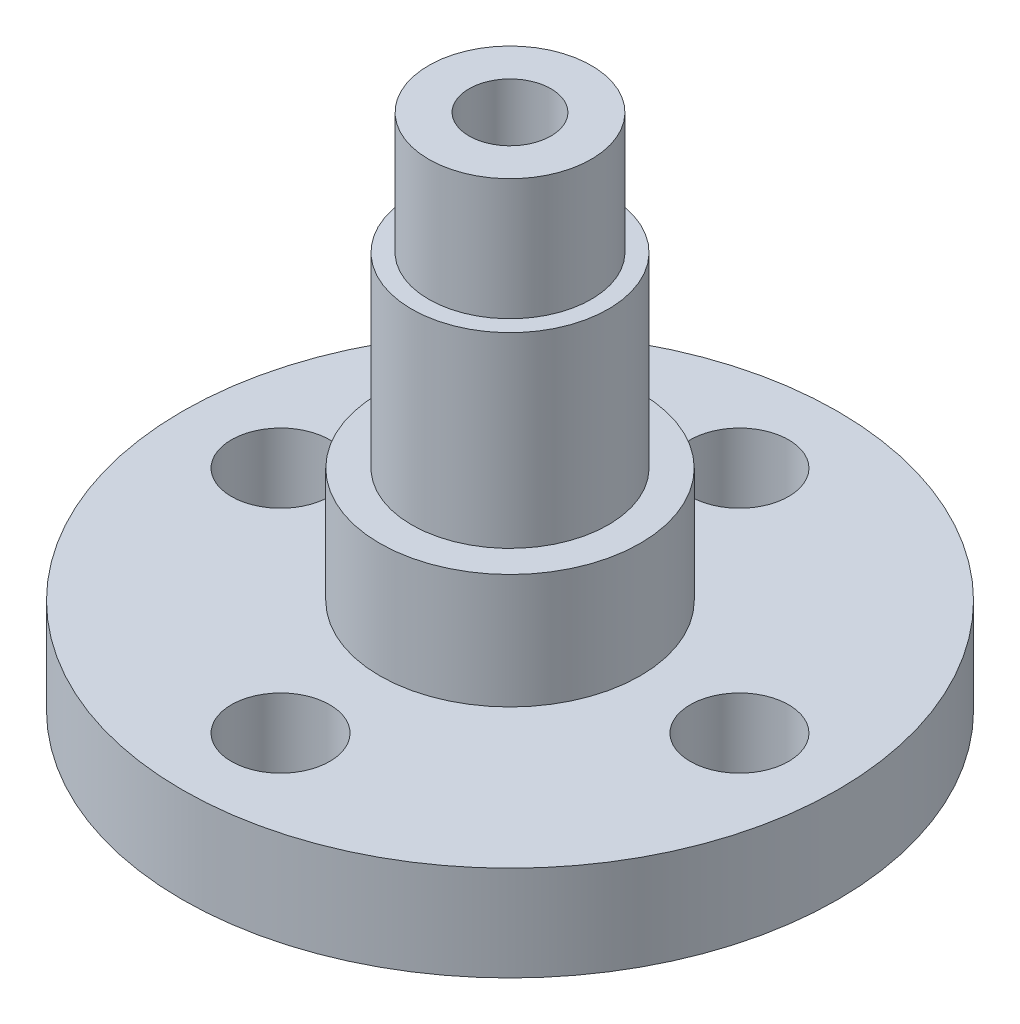
ISO-10303-21;
HEADER;
FILE_DESCRIPTION(('STEP AP214'),'2;1');
FILE_NAME('part.step','',(''),(''),'','','');
FILE_SCHEMA(('AUTOMOTIVE_DESIGN { 1 0 10303 214 1 1 1 1 }'));
ENDSEC;
DATA;
#1=APPLICATION_CONTEXT('core data for automotive mechanical design processes');
#2=APPLICATION_PROTOCOL_DEFINITION('international standard','automotive_design',2000,#1);
#3=PRODUCT_CONTEXT('',#1,'mechanical');
#4=PRODUCT('Part','Part','',(#3));
#5=PRODUCT_RELATED_PRODUCT_CATEGORY('part','',(#4));
#6=PRODUCT_DEFINITION_FORMATION('','',#4);
#7=PRODUCT_DEFINITION_CONTEXT('part definition',#1,'design');
#8=PRODUCT_DEFINITION('design','',#6,#7);
#9=PRODUCT_DEFINITION_SHAPE('','',#8);
#10=(LENGTH_UNIT() NAMED_UNIT(*) SI_UNIT(.MILLI.,.METRE.));
#11=(NAMED_UNIT(*) PLANE_ANGLE_UNIT() SI_UNIT($,.RADIAN.));
#12=(NAMED_UNIT(*) SI_UNIT($,.STERADIAN.) SOLID_ANGLE_UNIT());
#13=UNCERTAINTY_MEASURE_WITH_UNIT(LENGTH_MEASURE(1.E-05),#10,'distance_accuracy_value','');
#14=(GEOMETRIC_REPRESENTATION_CONTEXT(3) GLOBAL_UNCERTAINTY_ASSIGNED_CONTEXT((#13)) GLOBAL_UNIT_ASSIGNED_CONTEXT((#10,
#11,#12)) REPRESENTATION_CONTEXT('',''));
#15=CARTESIAN_POINT('',(0.,0.,0.));
#16=DIRECTION('',(0.,0.,1.));
#17=DIRECTION('',(1.,0.,0.));
#18=AXIS2_PLACEMENT_3D('',#15,#16,#17);
#19=CARTESIAN_POINT('',(-1.78635150621402,15.2779608029742,0.));
#20=DIRECTION('',(0.,1.,0.));
#21=DIRECTION('',(1.,0.,0.));
#22=AXIS2_PLACEMENT_3D('',#19,#20,#21);
#23=PLANE('',#22);
#24=CARTESIAN_POINT('',(-1.78635150621402,15.2779608029742,0.));
#25=DIRECTION('',(0.,-1.,0.));
#26=DIRECTION('',(0.,0.,1.));
#27=AXIS2_PLACEMENT_3D('',#24,#25,#26);
#28=CIRCLE('',#27,3.975);
#29=CARTESIAN_POINT('',(-1.78635150621402,15.2779608029742,3.975));
#30=VERTEX_POINT('',#29);
#31=EDGE_CURVE('E56',#30,#30,#28,.T.);
#32=ORIENTED_EDGE('',*,*,#31,.T.);
#33=EDGE_LOOP('',(#32));
#34=FACE_BOUND('',#33,.T.);
#35=CARTESIAN_POINT('',(5.21364849377225,15.2779608029742,0.));
#36=DIRECTION('',(0.,-1.,0.));
#37=DIRECTION('',(0.,0.,1.));
#38=AXIS2_PLACEMENT_3D('',#35,#36,#37);
#39=CIRCLE('',#38,1.5);
#40=CARTESIAN_POINT('',(5.21364849377225,15.2779608029742,1.50000000000005));
#41=VERTEX_POINT('',#40);
#42=EDGE_CURVE('E60',#41,#41,#39,.T.);
#43=ORIENTED_EDGE('',*,*,#42,.T.);
#44=EDGE_LOOP('',(#43));
#45=FACE_BOUND('',#44,.T.);
#46=CARTESIAN_POINT('',(-1.786351506214,15.2779608029742,-6.99999999998627));
#47=DIRECTION('',(0.,-1.,0.));
#48=DIRECTION('',(0.,0.,1.));
#49=AXIS2_PLACEMENT_3D('',#46,#47,#48);
#50=CIRCLE('',#49,1.5);
#51=CARTESIAN_POINT('',(-1.786351506214,15.2779608029742,-5.49999999998627));
#52=VERTEX_POINT('',#51);
#53=EDGE_CURVE('E68',#52,#52,#50,.T.);
#54=ORIENTED_EDGE('',*,*,#53,.T.);
#55=EDGE_LOOP('',(#54));
#56=FACE_BOUND('',#55,.T.);
#57=CARTESIAN_POINT('',(-8.7863515062003,15.2779608029742,0.));
#58=DIRECTION('',(0.,-1.,0.));
#59=DIRECTION('',(0.,0.,1.));
#60=AXIS2_PLACEMENT_3D('',#57,#58,#59);
#61=CIRCLE('',#60,1.5);
#62=CARTESIAN_POINT('',(-8.7863515062003,15.2779608029742,1.5));
#63=VERTEX_POINT('',#62);
#64=EDGE_CURVE('E73',#63,#63,#61,.T.);
#65=ORIENTED_EDGE('',*,*,#64,.T.);
#66=EDGE_LOOP('',(#65));
#67=FACE_BOUND('',#66,.T.);
#68=CARTESIAN_POINT('',(-1.786351506214,15.2779608029742,6.99999999998627));
#69=DIRECTION('',(0.,-1.,0.));
#70=DIRECTION('',(0.,0.,1.));
#71=AXIS2_PLACEMENT_3D('',#68,#69,#70);
#72=CIRCLE('',#71,1.5);
#73=CARTESIAN_POINT('',(-1.786351506214,15.2779608029742,8.49999999998627));
#74=VERTEX_POINT('',#73);
#75=EDGE_CURVE('E81',#74,#74,#72,.T.);
#76=ORIENTED_EDGE('',*,*,#75,.T.);
#77=EDGE_LOOP('',(#76));
#78=FACE_BOUND('',#77,.T.);
#79=CARTESIAN_POINT('',(-1.78635150621402,15.2779608029742,0.));
#80=DIRECTION('',(0.,1.,0.));
#81=DIRECTION('',(0.,0.,1.));
#82=AXIS2_PLACEMENT_3D('',#79,#80,#81);
#83=CIRCLE('',#82,10.0000000000246);
#84=CARTESIAN_POINT('',(-1.78635150621402,15.2779608029742,10.0000000000246));
#85=VERTEX_POINT('',#84);
#86=EDGE_CURVE('E89',#85,#85,#83,.T.);
#87=ORIENTED_EDGE('',*,*,#86,.T.);
#88=EDGE_LOOP('',(#87));
#89=FACE_BOUND('',#88,.T.);
#90=ADVANCED_FACE('F15',(#34,#45,#56,#67,#78,#89),#23,.T.);
#91=CARTESIAN_POINT('',(-1.78635150621402,12.3779608029706,0.));
#92=DIRECTION('',(0.,1.,0.));
#93=DIRECTION('',(1.,0.,0.));
#94=AXIS2_PLACEMENT_3D('',#91,#92,#93);
#95=PLANE('',#94);
#96=CARTESIAN_POINT('',(5.21364849377225,12.3779608029706,0.));
#97=DIRECTION('',(0.,-1.,0.));
#98=DIRECTION('',(0.,0.,1.));
#99=AXIS2_PLACEMENT_3D('',#96,#97,#98);
#100=CIRCLE('',#99,1.5);
#101=CARTESIAN_POINT('',(5.21364849377225,12.3779608029706,1.50000000000005));
#102=VERTEX_POINT('',#101);
#103=EDGE_CURVE('E64',#102,#102,#100,.T.);
#104=ORIENTED_EDGE('',*,*,#103,.F.);
#105=EDGE_LOOP('',(#104));
#106=FACE_BOUND('',#105,.T.);
#107=CARTESIAN_POINT('',(-8.7863515062003,12.3779608029706,0.));
#108=DIRECTION('',(0.,-1.,0.));
#109=DIRECTION('',(0.,0.,1.));
#110=AXIS2_PLACEMENT_3D('',#107,#108,#109);
#111=CIRCLE('',#110,1.5);
#112=CARTESIAN_POINT('',(-8.7863515062003,12.3779608029706,1.5));
#113=VERTEX_POINT('',#112);
#114=EDGE_CURVE('E77',#113,#113,#111,.T.);
#115=ORIENTED_EDGE('',*,*,#114,.F.);
#116=EDGE_LOOP('',(#115));
#117=FACE_BOUND('',#116,.T.);
#118=CARTESIAN_POINT('',(-1.786351506214,12.3779608029706,6.99999999998627));
#119=DIRECTION('',(0.,-1.,0.));
#120=DIRECTION('',(0.,0.,1.));
#121=AXIS2_PLACEMENT_3D('',#118,#119,#120);
#122=CIRCLE('',#121,1.5);
#123=CARTESIAN_POINT('',(-1.786351506214,12.3779608029706,8.49999999998627));
#124=VERTEX_POINT('',#123);
#125=EDGE_CURVE('E85',#124,#124,#122,.T.);
#126=ORIENTED_EDGE('',*,*,#125,.F.);
#127=EDGE_LOOP('',(#126));
#128=FACE_BOUND('',#127,.T.);
#129=CARTESIAN_POINT('',(-1.786351506214,12.3779608029706,-6.99999999998627));
#130=DIRECTION('',(0.,-1.,0.));
#131=DIRECTION('',(0.,0.,1.));
#132=AXIS2_PLACEMENT_3D('',#129,#130,#131);
#133=CIRCLE('',#132,1.5);
#134=CARTESIAN_POINT('',(-1.786351506214,12.3779608029706,-5.49999999998627));
#135=VERTEX_POINT('',#134);
#136=EDGE_CURVE('E69',#135,#135,#133,.T.);
#137=ORIENTED_EDGE('',*,*,#136,.F.);
#138=EDGE_LOOP('',(#137));
#139=FACE_BOUND('',#138,.T.);
#140=CARTESIAN_POINT('',(-1.78635150621402,12.3779608029706,0.));
#141=DIRECTION('',(0.,1.,0.));
#142=DIRECTION('',(0.,0.,1.));
#143=AXIS2_PLACEMENT_3D('',#140,#141,#142);
#144=CIRCLE('',#143,10.0000000000246);
#145=CARTESIAN_POINT('',(-1.78635150621402,12.3779608029706,10.0000000000246));
#146=VERTEX_POINT('',#145);
#147=EDGE_CURVE('E93',#146,#146,#144,.T.);
#148=ORIENTED_EDGE('',*,*,#147,.F.);
#149=EDGE_LOOP('',(#148));
#150=FACE_BOUND('',#149,.T.);
#151=ADVANCED_FACE('F105',(#106,#117,#128,#139,#150),#95,.F.);
#152=CARTESIAN_POINT('',(-1.78635150621402,22.3779608029715,0.));
#153=DIRECTION('',(0.,1.,0.));
#154=DIRECTION('',(1.,0.,0.));
#155=AXIS2_PLACEMENT_3D('',#152,#153,#154);
#156=PLANE('',#155);
#157=CARTESIAN_POINT('',(-1.78635150621402,22.3779608029715,0.));
#158=DIRECTION('',(0.,1.,0.));
#159=DIRECTION('',(0.,0.,1.));
#160=AXIS2_PLACEMENT_3D('',#157,#158,#159);
#161=CIRCLE('',#160,1.25);
#162=CARTESIAN_POINT('',(-1.78635150621402,22.3779608029715,1.25));
#163=VERTEX_POINT('',#162);
#164=EDGE_CURVE('E48',#163,#163,#161,.T.);
#165=ORIENTED_EDGE('',*,*,#164,.T.);
#166=EDGE_LOOP('',(#165));
#167=FACE_BOUND('',#166,.T.);
#168=ADVANCED_FACE('F107',(#167),#156,.T.);
#169=CARTESIAN_POINT('',(-1.78635150621402,28.1779608029715,0.));
#170=DIRECTION('',(0.,1.,0.));
#171=DIRECTION('',(1.,0.,0.));
#172=AXIS2_PLACEMENT_3D('',#169,#170,#171);
#173=PLANE('',#172);
#174=CARTESIAN_POINT('',(-1.78635150621402,28.1779608029715,0.));
#175=DIRECTION('',(0.,-1.,0.));
#176=DIRECTION('',(0.,0.,1.));
#177=AXIS2_PLACEMENT_3D('',#174,#175,#176);
#178=CIRCLE('',#177,1.25);
#179=CARTESIAN_POINT('',(-1.78635150621402,28.1779608029715,1.25));
#180=VERTEX_POINT('',#179);
#181=EDGE_CURVE('E44',#180,#180,#178,.T.);
#182=ORIENTED_EDGE('',*,*,#181,.T.);
#183=EDGE_LOOP('',(#182));
#184=FACE_BOUND('',#183,.T.);
#185=CARTESIAN_POINT('',(-1.78635150621402,28.1779608029715,0.));
#186=DIRECTION('',(0.,1.,0.));
#187=DIRECTION('',(0.,0.,1.));
#188=AXIS2_PLACEMENT_3D('',#185,#186,#187);
#189=CIRCLE('',#188,2.48);
#190=CARTESIAN_POINT('',(-1.78635150621402,28.1779608029715,2.48));
#191=VERTEX_POINT('',#190);
#192=EDGE_CURVE('E10',#191,#191,#189,.T.);
#193=ORIENTED_EDGE('',*,*,#192,.T.);
#194=EDGE_LOOP('',(#193));
#195=FACE_BOUND('',#194,.T.);
#196=ADVANCED_FACE('F114',(#184,#195),#173,.T.);
#197=CARTESIAN_POINT('',(-1.78635150621402,24.4779608029706,0.));
#198=DIRECTION('',(0.,1.,0.));
#199=DIRECTION('',(1.,0.,0.));
#200=AXIS2_PLACEMENT_3D('',#197,#198,#199);
#201=PLANE('',#200);
#202=CARTESIAN_POINT('',(-1.78635150621402,24.4779608029706,0.));
#203=DIRECTION('',(0.,-1.,0.));
#204=DIRECTION('',(0.,0.,1.));
#205=AXIS2_PLACEMENT_3D('',#202,#203,#204);
#206=CIRCLE('',#205,2.48);
#207=CARTESIAN_POINT('',(-1.78635150621402,24.4779608029706,2.48));
#208=VERTEX_POINT('',#207);
#209=EDGE_CURVE('E22',#208,#208,#206,.T.);
#210=ORIENTED_EDGE('',*,*,#209,.T.);
#211=EDGE_LOOP('',(#210));
#212=FACE_BOUND('',#211,.T.);
#213=CARTESIAN_POINT('',(-1.78635150621402,24.4779608029706,0.));
#214=DIRECTION('',(0.,1.,0.));
#215=DIRECTION('',(0.,0.,1.));
#216=AXIS2_PLACEMENT_3D('',#213,#214,#215);
#217=CIRCLE('',#216,3.00000000001);
#218=CARTESIAN_POINT('',(-1.78635150621402,24.4779608029706,3.00000000001));
#219=VERTEX_POINT('',#218);
#220=EDGE_CURVE('E31',#219,#219,#217,.T.);
#221=ORIENTED_EDGE('',*,*,#220,.T.);
#222=EDGE_LOOP('',(#221));
#223=FACE_BOUND('',#222,.T.);
#224=ADVANCED_FACE('F121',(#212,#223),#201,.T.);
#225=CARTESIAN_POINT('',(0.,18.7779608029409,0.));
#226=DIRECTION('',(0.,1.,0.));
#227=DIRECTION('',(1.,0.,0.));
#228=AXIS2_PLACEMENT_3D('',#225,#226,#227);
#229=PLANE('',#228);
#230=CARTESIAN_POINT('',(-1.78635150621402,18.7779608029107,0.));
#231=DIRECTION('',(0.,1.,0.));
#232=DIRECTION('',(0.,0.,1.));
#233=AXIS2_PLACEMENT_3D('',#230,#231,#232);
#234=CIRCLE('',#233,3.00000000001);
#235=CARTESIAN_POINT('',(-1.78635150621402,18.7779608029107,3.00000000001));
#236=VERTEX_POINT('',#235);
#237=EDGE_CURVE('E38',#236,#236,#234,.T.);
#238=ORIENTED_EDGE('',*,*,#237,.F.);
#239=EDGE_LOOP('',(#238));
#240=FACE_BOUND('',#239,.T.);
#241=CARTESIAN_POINT('',(-1.78635150621402,18.7779608029409,0.));
#242=DIRECTION('',(0.,1.,0.));
#243=DIRECTION('',(0.,0.,1.));
#244=AXIS2_PLACEMENT_3D('',#241,#242,#243);
#245=CIRCLE('',#244,3.975);
#246=CARTESIAN_POINT('',(-1.78635150621402,18.7779608029409,3.975));
#247=VERTEX_POINT('',#246);
#248=EDGE_CURVE('E52',#247,#247,#245,.T.);
#249=ORIENTED_EDGE('',*,*,#248,.T.);
#250=EDGE_LOOP('',(#249));
#251=FACE_BOUND('',#250,.T.);
#252=ADVANCED_FACE('F124',(#240,#251),#229,.T.);
#253=CARTESIAN_POINT('',(-1.78635150621402,17.2361823129865,0.));
#254=DIRECTION('',(0.,1.,0.));
#255=DIRECTION('',(0.,0.,1.));
#256=AXIS2_PLACEMENT_3D('',#253,#254,#255);
#257=CYLINDRICAL_SURFACE('',#256,2.48);
#258=ORIENTED_EDGE('',*,*,#192,.F.);
#259=EDGE_LOOP('',(#258));
#260=FACE_BOUND('',#259,.T.);
#261=ORIENTED_EDGE('',*,*,#209,.F.);
#262=EDGE_LOOP('',(#261));
#263=FACE_BOUND('',#262,.T.);
#264=ADVANCED_FACE('F125',(#260,#263),#257,.T.);
#265=CARTESIAN_POINT('',(-1.78635150621402,28.3779608029711,0.));
#266=DIRECTION('',(0.,1.,0.));
#267=DIRECTION('',(0.,0.,1.));
#268=AXIS2_PLACEMENT_3D('',#265,#266,#267);
#269=CYLINDRICAL_SURFACE('',#268,3.00000000001);
#270=ORIENTED_EDGE('',*,*,#220,.F.);
#271=EDGE_LOOP('',(#270));
#272=FACE_BOUND('',#271,.T.);
#273=ORIENTED_EDGE('',*,*,#237,.T.);
#274=EDGE_LOOP('',(#273));
#275=FACE_BOUND('',#274,.T.);
#276=ADVANCED_FACE('F128',(#272,#275),#269,.T.);
#277=CARTESIAN_POINT('',(-1.78635150621402,22.3779608029715,0.));
#278=DIRECTION('',(0.,1.,0.));
#279=DIRECTION('',(0.,0.,1.));
#280=AXIS2_PLACEMENT_3D('',#277,#278,#279);
#281=CYLINDRICAL_SURFACE('',#280,1.25);
#282=ORIENTED_EDGE('',*,*,#181,.F.);
#283=EDGE_LOOP('',(#282));
#284=FACE_BOUND('',#283,.T.);
#285=ORIENTED_EDGE('',*,*,#164,.F.);
#286=EDGE_LOOP('',(#285));
#287=FACE_BOUND('',#286,.T.);
#288=ADVANCED_FACE('F135',(#284,#287),#281,.F.);
#289=CARTESIAN_POINT('',(-1.78635150621402,3.96425230395596,0.));
#290=DIRECTION('',(0.,1.,0.));
#291=DIRECTION('',(0.,0.,1.));
#292=AXIS2_PLACEMENT_3D('',#289,#290,#291);
#293=CYLINDRICAL_SURFACE('',#292,3.975);
#294=ORIENTED_EDGE('',*,*,#248,.F.);
#295=EDGE_LOOP('',(#294));
#296=FACE_BOUND('',#295,.T.);
#297=ORIENTED_EDGE('',*,*,#31,.F.);
#298=EDGE_LOOP('',(#297));
#299=FACE_BOUND('',#298,.T.);
#300=ADVANCED_FACE('F139',(#296,#299),#293,.T.);
#301=CARTESIAN_POINT('',(5.21364849377225,6.77796080297416,0.));
#302=DIRECTION('',(0.,1.,0.));
#303=DIRECTION('',(0.,0.,1.));
#304=AXIS2_PLACEMENT_3D('',#301,#302,#303);
#305=CYLINDRICAL_SURFACE('',#304,1.5);
#306=ORIENTED_EDGE('',*,*,#42,.F.);
#307=EDGE_LOOP('',(#306));
#308=FACE_BOUND('',#307,.T.);
#309=ORIENTED_EDGE('',*,*,#103,.T.);
#310=EDGE_LOOP('',(#309));
#311=FACE_BOUND('',#310,.T.);
#312=ADVANCED_FACE('F143',(#308,#311),#305,.F.);
#313=CARTESIAN_POINT('',(-1.786351506214,6.77796080297416,-6.99999999998627));
#314=DIRECTION('',(0.,1.,0.));
#315=DIRECTION('',(0.,0.,1.));
#316=AXIS2_PLACEMENT_3D('',#313,#314,#315);
#317=CYLINDRICAL_SURFACE('',#316,1.5);
#318=ORIENTED_EDGE('',*,*,#53,.F.);
#319=EDGE_LOOP('',(#318));
#320=FACE_BOUND('',#319,.T.);
#321=ORIENTED_EDGE('',*,*,#136,.T.);
#322=EDGE_LOOP('',(#321));
#323=FACE_BOUND('',#322,.T.);
#324=ADVANCED_FACE('F145',(#320,#323),#317,.F.);
#325=CARTESIAN_POINT('',(-8.7863515062003,6.77796080297416,0.));
#326=DIRECTION('',(0.,1.,0.));
#327=DIRECTION('',(0.,0.,1.));
#328=AXIS2_PLACEMENT_3D('',#325,#326,#327);
#329=CYLINDRICAL_SURFACE('',#328,1.5);
#330=ORIENTED_EDGE('',*,*,#64,.F.);
#331=EDGE_LOOP('',(#330));
#332=FACE_BOUND('',#331,.T.);
#333=ORIENTED_EDGE('',*,*,#114,.T.);
#334=EDGE_LOOP('',(#333));
#335=FACE_BOUND('',#334,.T.);
#336=ADVANCED_FACE('F147',(#332,#335),#329,.F.);
#337=CARTESIAN_POINT('',(-1.786351506214,6.77796080297416,6.99999999998627));
#338=DIRECTION('',(0.,1.,0.));
#339=DIRECTION('',(0.,0.,1.));
#340=AXIS2_PLACEMENT_3D('',#337,#338,#339);
#341=CYLINDRICAL_SURFACE('',#340,1.5);
#342=ORIENTED_EDGE('',*,*,#75,.F.);
#343=EDGE_LOOP('',(#342));
#344=FACE_BOUND('',#343,.T.);
#345=ORIENTED_EDGE('',*,*,#125,.T.);
#346=EDGE_LOOP('',(#345));
#347=FACE_BOUND('',#346,.T.);
#348=ADVANCED_FACE('F152',(#344,#347),#341,.F.);
#349=CARTESIAN_POINT('',(-1.78635150621402,28.3779608029711,0.));
#350=DIRECTION('',(0.,1.,0.));
#351=DIRECTION('',(0.,0.,1.));
#352=AXIS2_PLACEMENT_3D('',#349,#350,#351);
#353=CYLINDRICAL_SURFACE('',#352,10.0000000000246);
#354=ORIENTED_EDGE('',*,*,#86,.F.);
#355=EDGE_LOOP('',(#354));
#356=FACE_BOUND('',#355,.T.);
#357=ORIENTED_EDGE('',*,*,#147,.T.);
#358=EDGE_LOOP('',(#357));
#359=FACE_BOUND('',#358,.T.);
#360=ADVANCED_FACE('F103',(#356,#359),#353,.T.);
#361=CLOSED_SHELL('',(#90,#151,#168,#196,#224,#252,#264,#276,#288,#300,#312,#324,#336,#348,#360));
#362=MANIFOLD_SOLID_BREP('B1',#361);
#363=ADVANCED_BREP_SHAPE_REPRESENTATION('',(#18,#362),#14);
#364=SHAPE_DEFINITION_REPRESENTATION(#9,#363);
ENDSEC;
END-ISO-10303-21;
